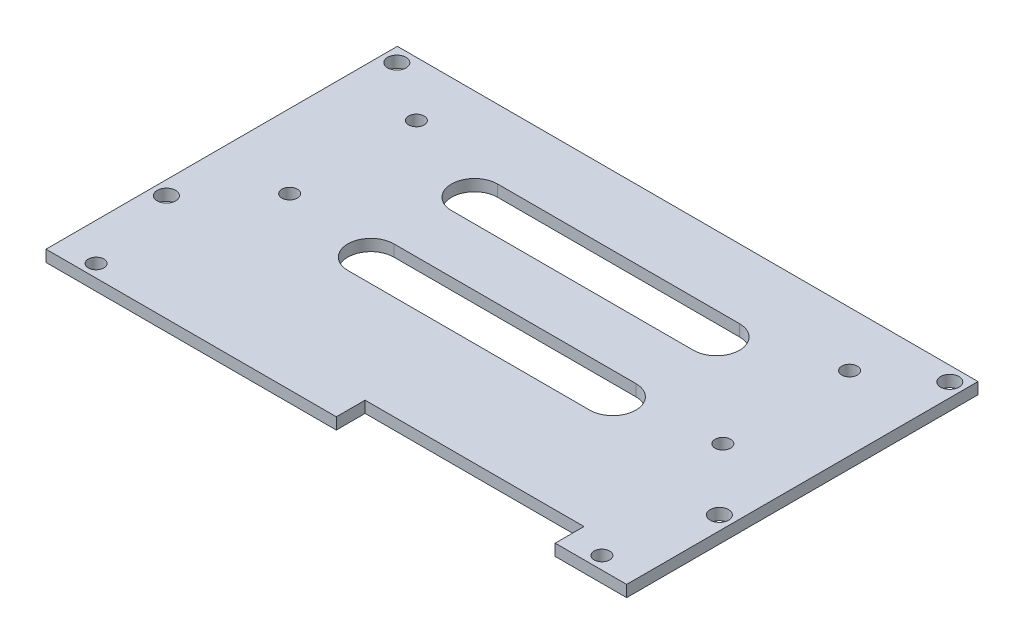
ISO-10303-21;
HEADER;
FILE_DESCRIPTION(('STEP AP214'),'2;1');
FILE_NAME('part.step','',(''),(''),'','','');
FILE_SCHEMA(('AUTOMOTIVE_DESIGN { 1 0 10303 214 1 1 1 1 }'));
ENDSEC;
DATA;
#1=APPLICATION_CONTEXT('core data for automotive mechanical design processes');
#2=APPLICATION_PROTOCOL_DEFINITION('international standard','automotive_design',2000,#1);
#3=PRODUCT_CONTEXT('',#1,'mechanical');
#4=PRODUCT('Part','Part','',(#3));
#5=PRODUCT_RELATED_PRODUCT_CATEGORY('part','',(#4));
#6=PRODUCT_DEFINITION_FORMATION('','',#4);
#7=PRODUCT_DEFINITION_CONTEXT('part definition',#1,'design');
#8=PRODUCT_DEFINITION('design','',#6,#7);
#9=PRODUCT_DEFINITION_SHAPE('','',#8);
#10=(LENGTH_UNIT() NAMED_UNIT(*) SI_UNIT(.MILLI.,.METRE.));
#11=(NAMED_UNIT(*) PLANE_ANGLE_UNIT() SI_UNIT($,.RADIAN.));
#12=(NAMED_UNIT(*) SI_UNIT($,.STERADIAN.) SOLID_ANGLE_UNIT());
#13=UNCERTAINTY_MEASURE_WITH_UNIT(LENGTH_MEASURE(1.E-05),#10,'distance_accuracy_value','');
#14=(GEOMETRIC_REPRESENTATION_CONTEXT(3) GLOBAL_UNCERTAINTY_ASSIGNED_CONTEXT((#13)) GLOBAL_UNIT_ASSIGNED_CONTEXT((#10,
#11,#12)) REPRESENTATION_CONTEXT('',''));
#15=CARTESIAN_POINT('',(0.,0.,0.));
#16=DIRECTION('',(0.,0.,1.));
#17=DIRECTION('',(1.,0.,0.));
#18=AXIS2_PLACEMENT_3D('',#15,#16,#17);
#19=CARTESIAN_POINT('',(-40.4,2.,27.));
#20=DIRECTION('',(0.,0.,-1.));
#21=DIRECTION('',(-1.,0.,0.));
#22=AXIS2_PLACEMENT_3D('',#19,#20,#21);
#23=PLANE('',#22);
#24=DIRECTION('',(1.,0.,0.));
#25=VECTOR('',#24,1.);
#26=CARTESIAN_POINT('',(-40.4,0.,27.));
#27=LINE('',#26,#25);
#28=CARTESIAN_POINT('',(-50.4,0.,27.));
#29=VERTEX_POINT('',#28);
#30=CARTESIAN_POINT('',(0.,0.,27.));
#31=VERTEX_POINT('',#30);
#32=EDGE_CURVE('E379',#29,#31,#27,.T.);
#33=ORIENTED_EDGE('',*,*,#32,.T.);
#34=DIRECTION('',(0.,-1.,0.));
#35=VECTOR('',#34,1.);
#36=CARTESIAN_POINT('',(0.,2.001,27.));
#37=LINE('',#36,#35);
#38=CARTESIAN_POINT('',(0.,2.,27.));
#39=VERTEX_POINT('',#38);
#40=EDGE_CURVE('E169',#39,#31,#37,.T.);
#41=ORIENTED_EDGE('',*,*,#40,.F.);
#42=DIRECTION('',(1.,0.,0.));
#43=VECTOR('',#42,1.);
#44=CARTESIAN_POINT('',(50.4,2.,27.));
#45=LINE('',#44,#43);
#46=CARTESIAN_POINT('',(-50.4,2.,27.));
#47=VERTEX_POINT('',#46);
#48=EDGE_CURVE('E353',#47,#39,#45,.T.);
#49=ORIENTED_EDGE('',*,*,#48,.F.);
#50=DIRECTION('',(0.,-1.,0.));
#51=VECTOR('',#50,1.);
#52=CARTESIAN_POINT('',(-50.4,2.,27.));
#53=LINE('',#52,#51);
#54=EDGE_CURVE('E367',#47,#29,#53,.T.);
#55=ORIENTED_EDGE('',*,*,#54,.T.);
#56=EDGE_LOOP('',(#33,#41,#49,#55));
#57=FACE_BOUND('',#56,.T.);
#58=ADVANCED_FACE('F39',(#57),#23,.F.);
#59=CARTESIAN_POINT('',(0.,2.,0.));
#60=DIRECTION('',(0.,1.,0.));
#61=DIRECTION('',(0.,0.,1.));
#62=AXIS2_PLACEMENT_3D('',#59,#60,#61);
#63=PLANE('',#62);
#64=DIRECTION('',(0.,0.,-1.));
#65=VECTOR('',#64,1.);
#66=CARTESIAN_POINT('',(0.,2.,34.0093244278953));
#67=LINE('',#66,#65);
#68=CARTESIAN_POINT('',(0.,2.,22.));
#69=VERTEX_POINT('',#68);
#70=EDGE_CURVE('E173',#39,#69,#67,.T.);
#71=ORIENTED_EDGE('',*,*,#70,.T.);
#72=DIRECTION('',(1.,0.,0.));
#73=VECTOR('',#72,1.);
#74=CARTESIAN_POINT('',(0.,2.,22.));
#75=LINE('',#74,#73);
#76=CARTESIAN_POINT('',(38.,2.,22.));
#77=VERTEX_POINT('',#76);
#78=EDGE_CURVE('E159',#69,#77,#75,.T.);
#79=ORIENTED_EDGE('',*,*,#78,.T.);
#80=DIRECTION('',(0.,0.,1.));
#81=VECTOR('',#80,1.);
#82=CARTESIAN_POINT('',(38.,2.,34.0093244278953));
#83=LINE('',#82,#81);
#84=CARTESIAN_POINT('',(38.,2.,27.));
#85=VERTEX_POINT('',#84);
#86=EDGE_CURVE('E420',#77,#85,#83,.T.);
#87=ORIENTED_EDGE('',*,*,#86,.T.);
#88=CARTESIAN_POINT('',(50.4,2.,27.));
#89=VERTEX_POINT('',#88);
#90=EDGE_CURVE('E358',#85,#89,#45,.T.);
#91=ORIENTED_EDGE('',*,*,#90,.T.);
#92=DIRECTION('',(0.,0.,-1.));
#93=VECTOR('',#92,1.);
#94=CARTESIAN_POINT('',(50.4,2.,-27.));
#95=LINE('',#94,#93);
#96=CARTESIAN_POINT('',(50.4,2.,-34.));
#97=VERTEX_POINT('',#96);
#98=EDGE_CURVE('E357',#89,#97,#95,.T.);
#99=ORIENTED_EDGE('',*,*,#98,.T.);
#100=DIRECTION('',(-1.,0.,0.));
#101=VECTOR('',#100,1.);
#102=CARTESIAN_POINT('',(-50.4,2.,-34.));
#103=LINE('',#102,#101);
#104=CARTESIAN_POINT('',(-50.4,2.,-34.));
#105=VERTEX_POINT('',#104);
#106=EDGE_CURVE('E361',#97,#105,#103,.T.);
#107=ORIENTED_EDGE('',*,*,#106,.T.);
#108=DIRECTION('',(0.,0.,1.));
#109=VECTOR('',#108,1.);
#110=CARTESIAN_POINT('',(-50.4,2.,-27.));
#111=LINE('',#110,#109);
#112=EDGE_CURVE('E364',#105,#47,#111,.T.);
#113=ORIENTED_EDGE('',*,*,#112,.T.);
#114=ORIENTED_EDGE('',*,*,#48,.T.);
#115=EDGE_LOOP('',(#71,#79,#87,#91,#99,#107,#113,#114));
#116=FACE_BOUND('',#115,.T.);
#117=CARTESIAN_POINT('',(-37.6,2.,-2.5));
#118=DIRECTION('',(0.,1.,0.));
#119=DIRECTION('',(0.,0.,1.));
#120=AXIS2_PLACEMENT_3D('',#117,#118,#119);
#121=CIRCLE('',#120,1.35);
#122=CARTESIAN_POINT('',(-37.6,2.,-1.15));
#123=VERTEX_POINT('',#122);
#124=EDGE_CURVE('E197',#123,#123,#121,.T.);
#125=ORIENTED_EDGE('',*,*,#124,.F.);
#126=EDGE_LOOP('',(#125));
#127=FACE_BOUND('',#126,.T.);
#128=CARTESIAN_POINT('',(48.,2.,8.49999999999999));
#129=DIRECTION('',(0.,1.,0.));
#130=DIRECTION('',(0.,0.,-1.));
#131=AXIS2_PLACEMENT_3D('',#128,#129,#130);
#132=CIRCLE('',#131,1.6);
#133=CARTESIAN_POINT('',(48.,2.,6.89999999999999));
#134=VERTEX_POINT('',#133);
#135=EDGE_CURVE('E213',#134,#134,#132,.T.);
#136=ORIENTED_EDGE('',*,*,#135,.F.);
#137=EDGE_LOOP('',(#136));
#138=FACE_BOUND('',#137,.T.);
#139=CARTESIAN_POINT('',(37.6,2.,-24.5));
#140=DIRECTION('',(0.,1.,0.));
#141=DIRECTION('',(0.,0.,-1.));
#142=AXIS2_PLACEMENT_3D('',#139,#140,#141);
#143=CIRCLE('',#142,1.35);
#144=CARTESIAN_POINT('',(37.6,2.,-25.85));
#145=VERTEX_POINT('',#144);
#146=EDGE_CURVE('E229',#145,#145,#143,.T.);
#147=ORIENTED_EDGE('',*,*,#146,.F.);
#148=EDGE_LOOP('',(#147));
#149=FACE_BOUND('',#148,.T.);
#150=DIRECTION('',(-1.,0.,0.));
#151=VECTOR('',#150,1.);
#152=CARTESIAN_POINT('',(-21.,2.,-4.));
#153=LINE('',#152,#151);
#154=CARTESIAN_POINT('',(21.,2.,-4.));
#155=VERTEX_POINT('',#154);
#156=CARTESIAN_POINT('',(-21.,2.,-4.));
#157=VERTEX_POINT('',#156);
#158=EDGE_CURVE('E289',#155,#157,#153,.T.);
#159=ORIENTED_EDGE('',*,*,#158,.F.);
#160=CARTESIAN_POINT('',(21.,2.,0.));
#161=DIRECTION('',(0.,1.,0.));
#162=DIRECTION('',(0.,0.,-1.));
#163=AXIS2_PLACEMENT_3D('',#160,#161,#162);
#164=CIRCLE('',#163,4.);
#165=CARTESIAN_POINT('',(21.,2.,4.));
#166=VERTEX_POINT('',#165);
#167=EDGE_CURVE('E286',#166,#155,#164,.T.);
#168=ORIENTED_EDGE('',*,*,#167,.F.);
#169=DIRECTION('',(1.,0.,0.));
#170=VECTOR('',#169,1.);
#171=CARTESIAN_POINT('',(-21.,2.,4.));
#172=LINE('',#171,#170);
#173=CARTESIAN_POINT('',(-21.,2.,4.));
#174=VERTEX_POINT('',#173);
#175=EDGE_CURVE('E297',#174,#166,#172,.T.);
#176=ORIENTED_EDGE('',*,*,#175,.F.);
#177=CARTESIAN_POINT('',(-21.,2.,0.));
#178=DIRECTION('',(0.,1.,0.));
#179=DIRECTION('',(0.,0.,1.));
#180=AXIS2_PLACEMENT_3D('',#177,#178,#179);
#181=CIRCLE('',#180,4.);
#182=EDGE_CURVE('E293',#157,#174,#181,.T.);
#183=ORIENTED_EDGE('',*,*,#182,.F.);
#184=EDGE_LOOP('',(#159,#168,#176,#183));
#185=FACE_BOUND('',#184,.T.);
#186=CARTESIAN_POINT('',(-37.6,2.,-24.5));
#187=DIRECTION('',(0.,1.,0.));
#188=DIRECTION('',(0.,0.,1.));
#189=AXIS2_PLACEMENT_3D('',#186,#187,#188);
#190=CIRCLE('',#189,1.35);
#191=CARTESIAN_POINT('',(-37.6,2.,-23.15));
#192=VERTEX_POINT('',#191);
#193=EDGE_CURVE('E329',#192,#192,#190,.T.);
#194=ORIENTED_EDGE('',*,*,#193,.F.);
#195=EDGE_LOOP('',(#194));
#196=FACE_BOUND('',#195,.T.);
#197=CARTESIAN_POINT('',(-48.,2.,-31.5));
#198=DIRECTION('',(0.,1.,0.));
#199=DIRECTION('',(0.,0.,1.));
#200=AXIS2_PLACEMENT_3D('',#197,#198,#199);
#201=CIRCLE('',#200,1.6);
#202=CARTESIAN_POINT('',(-48.,2.,-29.9));
#203=VERTEX_POINT('',#202);
#204=EDGE_CURVE('E345',#203,#203,#201,.T.);
#205=ORIENTED_EDGE('',*,*,#204,.F.);
#206=EDGE_LOOP('',(#205));
#207=FACE_BOUND('',#206,.T.);
#208=CARTESIAN_POINT('',(-48.,2.,8.5));
#209=DIRECTION('',(0.,1.,0.));
#210=DIRECTION('',(0.,0.,1.));
#211=AXIS2_PLACEMENT_3D('',#208,#209,#210);
#212=CIRCLE('',#211,1.6);
#213=CARTESIAN_POINT('',(-48.,2.,10.1));
#214=VERTEX_POINT('',#213);
#215=EDGE_CURVE('E337',#214,#214,#212,.T.);
#216=ORIENTED_EDGE('',*,*,#215,.F.);
#217=EDGE_LOOP('',(#216));
#218=FACE_BOUND('',#217,.T.);
#219=CARTESIAN_POINT('',(-43.8999999999998,2.,24.8));
#220=DIRECTION('',(0.,1.,0.));
#221=DIRECTION('',(0.,0.,1.));
#222=AXIS2_PLACEMENT_3D('',#219,#220,#221);
#223=CIRCLE('',#222,1.35);
#224=CARTESIAN_POINT('',(-43.8999999999998,2.,26.15));
#225=VERTEX_POINT('',#224);
#226=EDGE_CURVE('E278',#225,#225,#223,.T.);
#227=ORIENTED_EDGE('',*,*,#226,.F.);
#228=EDGE_LOOP('',(#227));
#229=FACE_BOUND('',#228,.T.);
#230=DIRECTION('',(-1.,0.,0.));
#231=VECTOR('',#230,1.);
#232=CARTESIAN_POINT('',(-21.0000000000001,2.,-22.));
#233=LINE('',#232,#231);
#234=CARTESIAN_POINT('',(20.9999999999999,2.,-22.));
#235=VERTEX_POINT('',#234);
#236=CARTESIAN_POINT('',(-21.0000000000001,2.,-22.));
#237=VERTEX_POINT('',#236);
#238=EDGE_CURVE('E240',#235,#237,#233,.T.);
#239=ORIENTED_EDGE('',*,*,#238,.F.);
#240=CARTESIAN_POINT('',(20.9999999999999,2.,-18.));
#241=DIRECTION('',(0.,1.,0.));
#242=DIRECTION('',(0.,0.,-1.));
#243=AXIS2_PLACEMENT_3D('',#240,#241,#242);
#244=CIRCLE('',#243,4.);
#245=CARTESIAN_POINT('',(20.9999999999999,2.,-14.));
#246=VERTEX_POINT('',#245);
#247=EDGE_CURVE('E237',#246,#235,#244,.T.);
#248=ORIENTED_EDGE('',*,*,#247,.F.);
#249=DIRECTION('',(1.,0.,0.));
#250=VECTOR('',#249,1.);
#251=CARTESIAN_POINT('',(-21.0000000000001,2.,-14.));
#252=LINE('',#251,#250);
#253=CARTESIAN_POINT('',(-21.0000000000001,2.,-14.));
#254=VERTEX_POINT('',#253);
#255=EDGE_CURVE('E247',#254,#246,#252,.T.);
#256=ORIENTED_EDGE('',*,*,#255,.F.);
#257=CARTESIAN_POINT('',(-21.0000000000001,2.,-18.));
#258=DIRECTION('',(0.,1.,0.));
#259=DIRECTION('',(0.,0.,1.));
#260=AXIS2_PLACEMENT_3D('',#257,#258,#259);
#261=CIRCLE('',#260,4.);
#262=EDGE_CURVE('E244',#237,#254,#261,.T.);
#263=ORIENTED_EDGE('',*,*,#262,.F.);
#264=EDGE_LOOP('',(#239,#248,#256,#263));
#265=FACE_BOUND('',#264,.T.);
#266=CARTESIAN_POINT('',(43.8999999999998,2.,24.8));
#267=DIRECTION('',(0.,1.,0.));
#268=DIRECTION('',(0.,0.,-1.));
#269=AXIS2_PLACEMENT_3D('',#266,#267,#268);
#270=CIRCLE('',#269,1.35);
#271=CARTESIAN_POINT('',(43.8999999999998,2.,23.45));
#272=VERTEX_POINT('',#271);
#273=EDGE_CURVE('E221',#272,#272,#270,.T.);
#274=ORIENTED_EDGE('',*,*,#273,.F.);
#275=EDGE_LOOP('',(#274));
#276=FACE_BOUND('',#275,.T.);
#277=CARTESIAN_POINT('',(48.,2.,-31.5));
#278=DIRECTION('',(0.,1.,0.));
#279=DIRECTION('',(0.,0.,-1.));
#280=AXIS2_PLACEMENT_3D('',#277,#278,#279);
#281=CIRCLE('',#280,1.6);
#282=CARTESIAN_POINT('',(48.,2.,-33.1));
#283=VERTEX_POINT('',#282);
#284=EDGE_CURVE('E205',#283,#283,#281,.T.);
#285=ORIENTED_EDGE('',*,*,#284,.F.);
#286=EDGE_LOOP('',(#285));
#287=FACE_BOUND('',#286,.T.);
#288=CARTESIAN_POINT('',(37.6,2.,-2.5));
#289=DIRECTION('',(0.,1.,0.));
#290=DIRECTION('',(0.,0.,-1.));
#291=AXIS2_PLACEMENT_3D('',#288,#289,#290);
#292=CIRCLE('',#291,1.35);
#293=CARTESIAN_POINT('',(37.6,2.,-3.85));
#294=VERTEX_POINT('',#293);
#295=EDGE_CURVE('E189',#294,#294,#292,.T.);
#296=ORIENTED_EDGE('',*,*,#295,.F.);
#297=EDGE_LOOP('',(#296));
#298=FACE_BOUND('',#297,.T.);
#299=ADVANCED_FACE('F406',(#116,#127,#138,#149,#185,#196,#207,#218,#229,#265,#276,#287,#298),
#63,.T.);
#300=CARTESIAN_POINT('',(0.,0.,0.));
#301=DIRECTION('',(0.,1.,0.));
#302=DIRECTION('',(0.,0.,1.));
#303=AXIS2_PLACEMENT_3D('',#300,#301,#302);
#304=PLANE('',#303);
#305=CARTESIAN_POINT('',(-43.8999999999998,0.,24.8));
#306=DIRECTION('',(0.,1.,0.));
#307=DIRECTION('',(0.,0.,1.));
#308=AXIS2_PLACEMENT_3D('',#305,#306,#307);
#309=CIRCLE('',#308,1.35);
#310=CARTESIAN_POINT('',(-43.8999999999998,0.,26.15));
#311=VERTEX_POINT('',#310);
#312=EDGE_CURVE('E277',#311,#311,#309,.T.);
#313=ORIENTED_EDGE('',*,*,#312,.T.);
#314=EDGE_LOOP('',(#313));
#315=FACE_BOUND('',#314,.T.);
#316=CARTESIAN_POINT('',(21.,0.,0.));
#317=DIRECTION('',(0.,1.,0.));
#318=DIRECTION('',(0.,0.,-1.));
#319=AXIS2_PLACEMENT_3D('',#316,#317,#318);
#320=CIRCLE('',#319,4.);
#321=CARTESIAN_POINT('',(21.,0.,4.));
#322=VERTEX_POINT('',#321);
#323=CARTESIAN_POINT('',(21.,0.,-4.));
#324=VERTEX_POINT('',#323);
#325=EDGE_CURVE('E282',#322,#324,#320,.T.);
#326=ORIENTED_EDGE('',*,*,#325,.T.);
#327=DIRECTION('',(-1.,0.,0.));
#328=VECTOR('',#327,1.);
#329=CARTESIAN_POINT('',(-21.,0.,-4.));
#330=LINE('',#329,#328);
#331=CARTESIAN_POINT('',(-21.,0.,-4.));
#332=VERTEX_POINT('',#331);
#333=EDGE_CURVE('E304',#324,#332,#330,.T.);
#334=ORIENTED_EDGE('',*,*,#333,.T.);
#335=CARTESIAN_POINT('',(-21.,0.,0.));
#336=DIRECTION('',(0.,1.,0.));
#337=DIRECTION('',(0.,0.,1.));
#338=AXIS2_PLACEMENT_3D('',#335,#336,#337);
#339=CIRCLE('',#338,4.);
#340=CARTESIAN_POINT('',(-21.,0.,4.));
#341=VERTEX_POINT('',#340);
#342=EDGE_CURVE('E308',#332,#341,#339,.T.);
#343=ORIENTED_EDGE('',*,*,#342,.T.);
#344=DIRECTION('',(1.,0.,0.));
#345=VECTOR('',#344,1.);
#346=CARTESIAN_POINT('',(-21.,0.,4.));
#347=LINE('',#346,#345);
#348=EDGE_CURVE('E290',#341,#322,#347,.T.);
#349=ORIENTED_EDGE('',*,*,#348,.T.);
#350=EDGE_LOOP('',(#326,#334,#343,#349));
#351=FACE_BOUND('',#350,.T.);
#352=DIRECTION('',(1.,0.,0.));
#353=VECTOR('',#352,1.);
#354=CARTESIAN_POINT('',(0.,0.,22.));
#355=LINE('',#354,#353);
#356=CARTESIAN_POINT('',(0.,0.,22.));
#357=VERTEX_POINT('',#356);
#358=CARTESIAN_POINT('',(38.,0.,22.));
#359=VERTEX_POINT('',#358);
#360=EDGE_CURVE('E157',#357,#359,#355,.T.);
#361=ORIENTED_EDGE('',*,*,#360,.F.);
#362=DIRECTION('',(0.,0.,-1.));
#363=VECTOR('',#362,1.);
#364=CARTESIAN_POINT('',(0.,0.,34.0093244278953));
#365=LINE('',#364,#363);
#366=EDGE_CURVE('E166',#31,#357,#365,.T.);
#367=ORIENTED_EDGE('',*,*,#366,.F.);
#368=ORIENTED_EDGE('',*,*,#32,.F.);
#369=DIRECTION('',(0.,0.,1.));
#370=VECTOR('',#369,1.);
#371=CARTESIAN_POINT('',(-50.4,0.,-27.));
#372=LINE('',#371,#370);
#373=CARTESIAN_POINT('',(-50.4,0.,-34.));
#374=VERTEX_POINT('',#373);
#375=EDGE_CURVE('E374',#374,#29,#372,.T.);
#376=ORIENTED_EDGE('',*,*,#375,.F.);
#377=DIRECTION('',(-1.,0.,0.));
#378=VECTOR('',#377,1.);
#379=CARTESIAN_POINT('',(-50.4,0.,-34.));
#380=LINE('',#379,#378);
#381=CARTESIAN_POINT('',(50.4,0.,-34.));
#382=VERTEX_POINT('',#381);
#383=EDGE_CURVE('E370',#382,#374,#380,.T.);
#384=ORIENTED_EDGE('',*,*,#383,.F.);
#385=DIRECTION('',(0.,0.,-1.));
#386=VECTOR('',#385,1.);
#387=CARTESIAN_POINT('',(50.4,0.,-34.));
#388=LINE('',#387,#386);
#389=CARTESIAN_POINT('',(50.4,0.,27.));
#390=VERTEX_POINT('',#389);
#391=EDGE_CURVE('E349',#390,#382,#388,.T.);
#392=ORIENTED_EDGE('',*,*,#391,.F.);
#393=CARTESIAN_POINT('',(38.,0.,27.));
#394=VERTEX_POINT('',#393);
#395=EDGE_CURVE('E378',#394,#390,#27,.T.);
#396=ORIENTED_EDGE('',*,*,#395,.F.);
#397=DIRECTION('',(0.,0.,1.));
#398=VECTOR('',#397,1.);
#399=CARTESIAN_POINT('',(38.,0.,34.0093244278953));
#400=LINE('',#399,#398);
#401=EDGE_CURVE('E55',#359,#394,#400,.T.);
#402=ORIENTED_EDGE('',*,*,#401,.F.);
#403=EDGE_LOOP('',(#361,#367,#368,#376,#384,#392,#396,#402));
#404=FACE_BOUND('',#403,.T.);
#405=CARTESIAN_POINT('',(-48.,0.,-31.5));
#406=DIRECTION('',(0.,1.,0.));
#407=DIRECTION('',(0.,0.,1.));
#408=AXIS2_PLACEMENT_3D('',#405,#406,#407);
#409=CIRCLE('',#408,1.6);
#410=CARTESIAN_POINT('',(-48.,0.,-29.9));
#411=VERTEX_POINT('',#410);
#412=EDGE_CURVE('E341',#411,#411,#409,.T.);
#413=ORIENTED_EDGE('',*,*,#412,.T.);
#414=EDGE_LOOP('',(#413));
#415=FACE_BOUND('',#414,.T.);
#416=CARTESIAN_POINT('',(-48.,0.,8.5));
#417=DIRECTION('',(0.,1.,0.));
#418=DIRECTION('',(0.,0.,1.));
#419=AXIS2_PLACEMENT_3D('',#416,#417,#418);
#420=CIRCLE('',#419,1.6);
#421=CARTESIAN_POINT('',(-48.,0.,10.1));
#422=VERTEX_POINT('',#421);
#423=EDGE_CURVE('E333',#422,#422,#420,.T.);
#424=ORIENTED_EDGE('',*,*,#423,.T.);
#425=EDGE_LOOP('',(#424));
#426=FACE_BOUND('',#425,.T.);
#427=CARTESIAN_POINT('',(-37.6,0.,-24.5));
#428=DIRECTION('',(0.,1.,0.));
#429=DIRECTION('',(0.,0.,1.));
#430=AXIS2_PLACEMENT_3D('',#427,#428,#429);
#431=CIRCLE('',#430,1.35);
#432=CARTESIAN_POINT('',(-37.6,0.,-23.15));
#433=VERTEX_POINT('',#432);
#434=EDGE_CURVE('E328',#433,#433,#431,.T.);
#435=ORIENTED_EDGE('',*,*,#434,.T.);
#436=EDGE_LOOP('',(#435));
#437=FACE_BOUND('',#436,.T.);
#438=CARTESIAN_POINT('',(20.9999999999999,0.,-18.));
#439=DIRECTION('',(0.,1.,0.));
#440=DIRECTION('',(0.,0.,-1.));
#441=AXIS2_PLACEMENT_3D('',#438,#439,#440);
#442=CIRCLE('',#441,4.);
#443=CARTESIAN_POINT('',(20.9999999999999,0.,-14.));
#444=VERTEX_POINT('',#443);
#445=CARTESIAN_POINT('',(20.9999999999999,0.,-22.));
#446=VERTEX_POINT('',#445);
#447=EDGE_CURVE('E233',#444,#446,#442,.T.);
#448=ORIENTED_EDGE('',*,*,#447,.T.);
#449=DIRECTION('',(-1.,0.,0.));
#450=VECTOR('',#449,1.);
#451=CARTESIAN_POINT('',(-21.0000000000001,0.,-22.));
#452=LINE('',#451,#450);
#453=CARTESIAN_POINT('',(-21.0000000000001,0.,-22.));
#454=VERTEX_POINT('',#453);
#455=EDGE_CURVE('E254',#446,#454,#452,.T.);
#456=ORIENTED_EDGE('',*,*,#455,.T.);
#457=CARTESIAN_POINT('',(-21.0000000000001,0.,-18.));
#458=DIRECTION('',(0.,1.,0.));
#459=DIRECTION('',(0.,0.,1.));
#460=AXIS2_PLACEMENT_3D('',#457,#458,#459);
#461=CIRCLE('',#460,4.);
#462=CARTESIAN_POINT('',(-21.0000000000001,0.,-14.));
#463=VERTEX_POINT('',#462);
#464=EDGE_CURVE('E258',#454,#463,#461,.T.);
#465=ORIENTED_EDGE('',*,*,#464,.T.);
#466=DIRECTION('',(1.,0.,0.));
#467=VECTOR('',#466,1.);
#468=CARTESIAN_POINT('',(-21.0000000000001,0.,-14.));
#469=LINE('',#468,#467);
#470=EDGE_CURVE('E241',#463,#444,#469,.T.);
#471=ORIENTED_EDGE('',*,*,#470,.T.);
#472=EDGE_LOOP('',(#448,#456,#465,#471));
#473=FACE_BOUND('',#472,.T.);
#474=CARTESIAN_POINT('',(37.6,0.,-24.5));
#475=DIRECTION('',(0.,1.,0.));
#476=DIRECTION('',(0.,0.,-1.));
#477=AXIS2_PLACEMENT_3D('',#474,#475,#476);
#478=CIRCLE('',#477,1.35);
#479=CARTESIAN_POINT('',(37.6,0.,-25.85));
#480=VERTEX_POINT('',#479);
#481=EDGE_CURVE('E225',#480,#480,#478,.T.);
#482=ORIENTED_EDGE('',*,*,#481,.T.);
#483=EDGE_LOOP('',(#482));
#484=FACE_BOUND('',#483,.T.);
#485=CARTESIAN_POINT('',(43.8999999999998,0.,24.8));
#486=DIRECTION('',(0.,1.,0.));
#487=DIRECTION('',(0.,0.,-1.));
#488=AXIS2_PLACEMENT_3D('',#485,#486,#487);
#489=CIRCLE('',#488,1.35);
#490=CARTESIAN_POINT('',(43.8999999999998,0.,23.45));
#491=VERTEX_POINT('',#490);
#492=EDGE_CURVE('E217',#491,#491,#489,.T.);
#493=ORIENTED_EDGE('',*,*,#492,.T.);
#494=EDGE_LOOP('',(#493));
#495=FACE_BOUND('',#494,.T.);
#496=CARTESIAN_POINT('',(48.,0.,8.49999999999999));
#497=DIRECTION('',(0.,1.,0.));
#498=DIRECTION('',(0.,0.,-1.));
#499=AXIS2_PLACEMENT_3D('',#496,#497,#498);
#500=CIRCLE('',#499,1.6);
#501=CARTESIAN_POINT('',(48.,0.,6.89999999999999));
#502=VERTEX_POINT('',#501);
#503=EDGE_CURVE('E209',#502,#502,#500,.T.);
#504=ORIENTED_EDGE('',*,*,#503,.T.);
#505=EDGE_LOOP('',(#504));
#506=FACE_BOUND('',#505,.T.);
#507=CARTESIAN_POINT('',(48.,0.,-31.5));
#508=DIRECTION('',(0.,1.,0.));
#509=DIRECTION('',(0.,0.,-1.));
#510=AXIS2_PLACEMENT_3D('',#507,#508,#509);
#511=CIRCLE('',#510,1.6);
#512=CARTESIAN_POINT('',(48.,0.,-33.1));
#513=VERTEX_POINT('',#512);
#514=EDGE_CURVE('E201',#513,#513,#511,.T.);
#515=ORIENTED_EDGE('',*,*,#514,.T.);
#516=EDGE_LOOP('',(#515));
#517=FACE_BOUND('',#516,.T.);
#518=CARTESIAN_POINT('',(-37.6,0.,-2.5));
#519=DIRECTION('',(0.,1.,0.));
#520=DIRECTION('',(0.,0.,1.));
#521=AXIS2_PLACEMENT_3D('',#518,#519,#520);
#522=CIRCLE('',#521,1.35);
#523=CARTESIAN_POINT('',(-37.6,0.,-1.15));
#524=VERTEX_POINT('',#523);
#525=EDGE_CURVE('E193',#524,#524,#522,.T.);
#526=ORIENTED_EDGE('',*,*,#525,.T.);
#527=EDGE_LOOP('',(#526));
#528=FACE_BOUND('',#527,.T.);
#529=CARTESIAN_POINT('',(37.6,0.,-2.5));
#530=DIRECTION('',(0.,1.,0.));
#531=DIRECTION('',(0.,0.,-1.));
#532=AXIS2_PLACEMENT_3D('',#529,#530,#531);
#533=CIRCLE('',#532,1.35);
#534=CARTESIAN_POINT('',(37.6,0.,-3.85));
#535=VERTEX_POINT('',#534);
#536=EDGE_CURVE('E188',#535,#535,#533,.T.);
#537=ORIENTED_EDGE('',*,*,#536,.T.);
#538=EDGE_LOOP('',(#537));
#539=FACE_BOUND('',#538,.T.);
#540=ADVANCED_FACE('F175',(#315,#351,#404,#415,#426,#437,#473,#484,#495,#506,#517,#528,#539),
#304,.F.);
#541=CARTESIAN_POINT('',(50.4,2.,-34.));
#542=DIRECTION('',(-1.,0.,0.));
#543=DIRECTION('',(0.,0.,1.));
#544=AXIS2_PLACEMENT_3D('',#541,#542,#543);
#545=PLANE('',#544);
#546=ORIENTED_EDGE('',*,*,#391,.T.);
#547=DIRECTION('',(0.,-1.,0.));
#548=VECTOR('',#547,1.);
#549=CARTESIAN_POINT('',(50.4,2.,-34.));
#550=LINE('',#549,#548);
#551=EDGE_CURVE('E48',#97,#382,#550,.T.);
#552=ORIENTED_EDGE('',*,*,#551,.F.);
#553=ORIENTED_EDGE('',*,*,#98,.F.);
#554=DIRECTION('',(0.,-1.,0.));
#555=VECTOR('',#554,1.);
#556=CARTESIAN_POINT('',(50.4,2.,27.));
#557=LINE('',#556,#555);
#558=EDGE_CURVE('E11',#89,#390,#557,.T.);
#559=ORIENTED_EDGE('',*,*,#558,.T.);
#560=EDGE_LOOP('',(#546,#552,#553,#559));
#561=FACE_BOUND('',#560,.T.);
#562=ADVANCED_FACE('F41',(#561),#545,.F.);
#563=CARTESIAN_POINT('',(-50.4,2.,-34.));
#564=DIRECTION('',(0.,0.,1.));
#565=DIRECTION('',(1.,0.,0.));
#566=AXIS2_PLACEMENT_3D('',#563,#564,#565);
#567=PLANE('',#566);
#568=ORIENTED_EDGE('',*,*,#383,.T.);
#569=DIRECTION('',(0.,-1.,0.));
#570=VECTOR('',#569,1.);
#571=CARTESIAN_POINT('',(-50.4,2.,-34.));
#572=LINE('',#571,#570);
#573=EDGE_CURVE('E385',#105,#374,#572,.T.);
#574=ORIENTED_EDGE('',*,*,#573,.F.);
#575=ORIENTED_EDGE('',*,*,#106,.F.);
#576=ORIENTED_EDGE('',*,*,#551,.T.);
#577=EDGE_LOOP('',(#568,#574,#575,#576));
#578=FACE_BOUND('',#577,.T.);
#579=ADVANCED_FACE('F394',(#578),#567,.F.);
#580=CARTESIAN_POINT('',(-50.4,2.,-27.));
#581=DIRECTION('',(1.,0.,0.));
#582=DIRECTION('',(0.,0.,-1.));
#583=AXIS2_PLACEMENT_3D('',#580,#581,#582);
#584=PLANE('',#583);
#585=ORIENTED_EDGE('',*,*,#375,.T.);
#586=ORIENTED_EDGE('',*,*,#54,.F.);
#587=ORIENTED_EDGE('',*,*,#112,.F.);
#588=ORIENTED_EDGE('',*,*,#573,.T.);
#589=EDGE_LOOP('',(#585,#586,#587,#588));
#590=FACE_BOUND('',#589,.T.);
#591=ADVANCED_FACE('F401',(#590),#584,.F.);
#592=ORIENTED_EDGE('',*,*,#90,.F.);
#593=DIRECTION('',(0.,1.,0.));
#594=VECTOR('',#593,1.);
#595=CARTESIAN_POINT('',(38.,2.001,27.));
#596=LINE('',#595,#594);
#597=EDGE_CURVE('E413',#394,#85,#596,.T.);
#598=ORIENTED_EDGE('',*,*,#597,.F.);
#599=ORIENTED_EDGE('',*,*,#395,.T.);
#600=ORIENTED_EDGE('',*,*,#558,.F.);
#601=EDGE_LOOP('',(#592,#598,#599,#600));
#602=FACE_BOUND('',#601,.T.);
#603=ADVANCED_FACE('F412',(#602),#23,.F.);
#604=CARTESIAN_POINT('',(-48.,2.,-31.5));
#605=DIRECTION('',(0.,-1.,0.));
#606=DIRECTION('',(0.,0.,-1.));
#607=AXIS2_PLACEMENT_3D('',#604,#605,#606);
#608=CYLINDRICAL_SURFACE('',#607,1.6);
#609=ORIENTED_EDGE('',*,*,#204,.T.);
#610=EDGE_LOOP('',(#609));
#611=FACE_BOUND('',#610,.T.);
#612=ORIENTED_EDGE('',*,*,#412,.F.);
#613=EDGE_LOOP('',(#612));
#614=FACE_BOUND('',#613,.T.);
#615=ADVANCED_FACE('F444',(#611,#614),#608,.F.);
#616=CARTESIAN_POINT('',(-48.,2.,8.5));
#617=DIRECTION('',(0.,-1.,0.));
#618=DIRECTION('',(0.,0.,-1.));
#619=AXIS2_PLACEMENT_3D('',#616,#617,#618);
#620=CYLINDRICAL_SURFACE('',#619,1.6);
#621=ORIENTED_EDGE('',*,*,#215,.T.);
#622=EDGE_LOOP('',(#621));
#623=FACE_BOUND('',#622,.T.);
#624=ORIENTED_EDGE('',*,*,#423,.F.);
#625=EDGE_LOOP('',(#624));
#626=FACE_BOUND('',#625,.T.);
#627=ADVANCED_FACE('F449',(#623,#626),#620,.F.);
#628=CARTESIAN_POINT('',(-37.6,2.,-24.5));
#629=DIRECTION('',(0.,-1.,0.));
#630=DIRECTION('',(0.,0.,-1.));
#631=AXIS2_PLACEMENT_3D('',#628,#629,#630);
#632=CYLINDRICAL_SURFACE('',#631,1.35);
#633=ORIENTED_EDGE('',*,*,#193,.T.);
#634=EDGE_LOOP('',(#633));
#635=FACE_BOUND('',#634,.T.);
#636=ORIENTED_EDGE('',*,*,#434,.F.);
#637=EDGE_LOOP('',(#636));
#638=FACE_BOUND('',#637,.T.);
#639=ADVANCED_FACE('F468',(#635,#638),#632,.F.);
#640=CARTESIAN_POINT('',(21.,2.,0.));
#641=DIRECTION('',(0.,-1.,0.));
#642=DIRECTION('',(0.,0.,-1.));
#643=AXIS2_PLACEMENT_3D('',#640,#641,#642);
#644=CYLINDRICAL_SURFACE('',#643,4.);
#645=ORIENTED_EDGE('',*,*,#325,.F.);
#646=DIRECTION('',(0.,-1.,0.));
#647=VECTOR('',#646,1.);
#648=CARTESIAN_POINT('',(21.,2.,4.));
#649=LINE('',#648,#647);
#650=EDGE_CURVE('E300',#166,#322,#649,.T.);
#651=ORIENTED_EDGE('',*,*,#650,.F.);
#652=ORIENTED_EDGE('',*,*,#167,.T.);
#653=DIRECTION('',(0.,-1.,0.));
#654=VECTOR('',#653,1.);
#655=CARTESIAN_POINT('',(21.,2.,-4.));
#656=LINE('',#655,#654);
#657=EDGE_CURVE('E324',#155,#324,#656,.T.);
#658=ORIENTED_EDGE('',*,*,#657,.T.);
#659=EDGE_LOOP('',(#645,#651,#652,#658));
#660=FACE_BOUND('',#659,.T.);
#661=ADVANCED_FACE('F472',(#660),#644,.F.);
#662=CARTESIAN_POINT('',(-21.,2.,-4.));
#663=DIRECTION('',(0.,0.,1.));
#664=DIRECTION('',(1.,0.,0.));
#665=AXIS2_PLACEMENT_3D('',#662,#663,#664);
#666=PLANE('',#665);
#667=ORIENTED_EDGE('',*,*,#333,.F.);
#668=ORIENTED_EDGE('',*,*,#657,.F.);
#669=ORIENTED_EDGE('',*,*,#158,.T.);
#670=DIRECTION('',(0.,-1.,0.));
#671=VECTOR('',#670,1.);
#672=CARTESIAN_POINT('',(-21.,2.,-4.));
#673=LINE('',#672,#671);
#674=EDGE_CURVE('E321',#157,#332,#673,.T.);
#675=ORIENTED_EDGE('',*,*,#674,.T.);
#676=EDGE_LOOP('',(#667,#668,#669,#675));
#677=FACE_BOUND('',#676,.T.);
#678=ADVANCED_FACE('F476',(#677),#666,.T.);
#679=CARTESIAN_POINT('',(-21.,2.,0.));
#680=DIRECTION('',(0.,-1.,0.));
#681=DIRECTION('',(0.,0.,-1.));
#682=AXIS2_PLACEMENT_3D('',#679,#680,#681);
#683=CYLINDRICAL_SURFACE('',#682,4.);
#684=ORIENTED_EDGE('',*,*,#342,.F.);
#685=ORIENTED_EDGE('',*,*,#674,.F.);
#686=ORIENTED_EDGE('',*,*,#182,.T.);
#687=DIRECTION('',(0.,-1.,0.));
#688=VECTOR('',#687,1.);
#689=CARTESIAN_POINT('',(-21.,2.,4.));
#690=LINE('',#689,#688);
#691=EDGE_CURVE('E318',#174,#341,#690,.T.);
#692=ORIENTED_EDGE('',*,*,#691,.T.);
#693=EDGE_LOOP('',(#684,#685,#686,#692));
#694=FACE_BOUND('',#693,.T.);
#695=ADVANCED_FACE('F480',(#694),#683,.F.);
#696=CARTESIAN_POINT('',(-21.,2.,4.));
#697=DIRECTION('',(0.,0.,-1.));
#698=DIRECTION('',(-1.,0.,0.));
#699=AXIS2_PLACEMENT_3D('',#696,#697,#698);
#700=PLANE('',#699);
#701=ORIENTED_EDGE('',*,*,#348,.F.);
#702=ORIENTED_EDGE('',*,*,#691,.F.);
#703=ORIENTED_EDGE('',*,*,#175,.T.);
#704=ORIENTED_EDGE('',*,*,#650,.T.);
#705=EDGE_LOOP('',(#701,#702,#703,#704));
#706=FACE_BOUND('',#705,.T.);
#707=ADVANCED_FACE('F484',(#706),#700,.T.);
#708=CARTESIAN_POINT('',(-43.8999999999998,2.,24.8));
#709=DIRECTION('',(0.,-1.,0.));
#710=DIRECTION('',(0.,0.,-1.));
#711=AXIS2_PLACEMENT_3D('',#708,#709,#710);
#712=CYLINDRICAL_SURFACE('',#711,1.35);
#713=ORIENTED_EDGE('',*,*,#226,.T.);
#714=EDGE_LOOP('',(#713));
#715=FACE_BOUND('',#714,.T.);
#716=ORIENTED_EDGE('',*,*,#312,.F.);
#717=EDGE_LOOP('',(#716));
#718=FACE_BOUND('',#717,.T.);
#719=ADVANCED_FACE('F488',(#715,#718),#712,.F.);
#720=CARTESIAN_POINT('',(20.9999999999999,2.,-18.));
#721=DIRECTION('',(0.,-1.,0.));
#722=DIRECTION('',(0.,0.,-1.));
#723=AXIS2_PLACEMENT_3D('',#720,#721,#722);
#724=CYLINDRICAL_SURFACE('',#723,4.);
#725=ORIENTED_EDGE('',*,*,#447,.F.);
#726=DIRECTION('',(0.,-1.,0.));
#727=VECTOR('',#726,1.);
#728=CARTESIAN_POINT('',(20.9999999999999,2.,-14.));
#729=LINE('',#728,#727);
#730=EDGE_CURVE('E250',#246,#444,#729,.T.);
#731=ORIENTED_EDGE('',*,*,#730,.F.);
#732=ORIENTED_EDGE('',*,*,#247,.T.);
#733=DIRECTION('',(0.,-1.,0.));
#734=VECTOR('',#733,1.);
#735=CARTESIAN_POINT('',(20.9999999999999,2.,-22.));
#736=LINE('',#735,#734);
#737=EDGE_CURVE('E273',#235,#446,#736,.T.);
#738=ORIENTED_EDGE('',*,*,#737,.T.);
#739=EDGE_LOOP('',(#725,#731,#732,#738));
#740=FACE_BOUND('',#739,.T.);
#741=ADVANCED_FACE('F492',(#740),#724,.F.);
#742=CARTESIAN_POINT('',(-21.0000000000001,2.,-22.));
#743=DIRECTION('',(0.,0.,1.));
#744=DIRECTION('',(1.,0.,0.));
#745=AXIS2_PLACEMENT_3D('',#742,#743,#744);
#746=PLANE('',#745);
#747=ORIENTED_EDGE('',*,*,#455,.F.);
#748=ORIENTED_EDGE('',*,*,#737,.F.);
#749=ORIENTED_EDGE('',*,*,#238,.T.);
#750=DIRECTION('',(0.,-1.,0.));
#751=VECTOR('',#750,1.);
#752=CARTESIAN_POINT('',(-21.0000000000001,2.,-22.));
#753=LINE('',#752,#751);
#754=EDGE_CURVE('E270',#237,#454,#753,.T.);
#755=ORIENTED_EDGE('',*,*,#754,.T.);
#756=EDGE_LOOP('',(#747,#748,#749,#755));
#757=FACE_BOUND('',#756,.T.);
#758=ADVANCED_FACE('F496',(#757),#746,.T.);
#759=CARTESIAN_POINT('',(-21.0000000000001,2.,-18.));
#760=DIRECTION('',(0.,-1.,0.));
#761=DIRECTION('',(0.,0.,-1.));
#762=AXIS2_PLACEMENT_3D('',#759,#760,#761);
#763=CYLINDRICAL_SURFACE('',#762,4.);
#764=ORIENTED_EDGE('',*,*,#464,.F.);
#765=ORIENTED_EDGE('',*,*,#754,.F.);
#766=ORIENTED_EDGE('',*,*,#262,.T.);
#767=DIRECTION('',(0.,-1.,0.));
#768=VECTOR('',#767,1.);
#769=CARTESIAN_POINT('',(-21.0000000000001,2.,-14.));
#770=LINE('',#769,#768);
#771=EDGE_CURVE('E63',#254,#463,#770,.T.);
#772=ORIENTED_EDGE('',*,*,#771,.T.);
#773=EDGE_LOOP('',(#764,#765,#766,#772));
#774=FACE_BOUND('',#773,.T.);
#775=ADVANCED_FACE('F500',(#774),#763,.F.);
#776=CARTESIAN_POINT('',(-21.0000000000001,2.,-14.));
#777=DIRECTION('',(0.,0.,-1.));
#778=DIRECTION('',(-1.,0.,0.));
#779=AXIS2_PLACEMENT_3D('',#776,#777,#778);
#780=PLANE('',#779);
#781=ORIENTED_EDGE('',*,*,#470,.F.);
#782=ORIENTED_EDGE('',*,*,#771,.F.);
#783=ORIENTED_EDGE('',*,*,#255,.T.);
#784=ORIENTED_EDGE('',*,*,#730,.T.);
#785=EDGE_LOOP('',(#781,#782,#783,#784));
#786=FACE_BOUND('',#785,.T.);
#787=ADVANCED_FACE('F504',(#786),#780,.T.);
#788=CARTESIAN_POINT('',(37.6,2.,-24.5));
#789=DIRECTION('',(0.,-1.,0.));
#790=DIRECTION('',(0.,0.,-1.));
#791=AXIS2_PLACEMENT_3D('',#788,#789,#790);
#792=CYLINDRICAL_SURFACE('',#791,1.35);
#793=ORIENTED_EDGE('',*,*,#146,.T.);
#794=EDGE_LOOP('',(#793));
#795=FACE_BOUND('',#794,.T.);
#796=ORIENTED_EDGE('',*,*,#481,.F.);
#797=EDGE_LOOP('',(#796));
#798=FACE_BOUND('',#797,.T.);
#799=ADVANCED_FACE('F508',(#795,#798),#792,.F.);
#800=CARTESIAN_POINT('',(43.8999999999998,2.,24.8));
#801=DIRECTION('',(0.,-1.,0.));
#802=DIRECTION('',(0.,0.,-1.));
#803=AXIS2_PLACEMENT_3D('',#800,#801,#802);
#804=CYLINDRICAL_SURFACE('',#803,1.35);
#805=ORIENTED_EDGE('',*,*,#273,.T.);
#806=EDGE_LOOP('',(#805));
#807=FACE_BOUND('',#806,.T.);
#808=ORIENTED_EDGE('',*,*,#492,.F.);
#809=EDGE_LOOP('',(#808));
#810=FACE_BOUND('',#809,.T.);
#811=ADVANCED_FACE('F511',(#807,#810),#804,.F.);
#812=CARTESIAN_POINT('',(48.,2.,8.49999999999999));
#813=DIRECTION('',(0.,-1.,0.));
#814=DIRECTION('',(0.,0.,-1.));
#815=AXIS2_PLACEMENT_3D('',#812,#813,#814);
#816=CYLINDRICAL_SURFACE('',#815,1.6);
#817=ORIENTED_EDGE('',*,*,#135,.T.);
#818=EDGE_LOOP('',(#817));
#819=FACE_BOUND('',#818,.T.);
#820=ORIENTED_EDGE('',*,*,#503,.F.);
#821=EDGE_LOOP('',(#820));
#822=FACE_BOUND('',#821,.T.);
#823=ADVANCED_FACE('F515',(#819,#822),#816,.F.);
#824=CARTESIAN_POINT('',(48.,2.,-31.5));
#825=DIRECTION('',(0.,-1.,0.));
#826=DIRECTION('',(0.,0.,-1.));
#827=AXIS2_PLACEMENT_3D('',#824,#825,#826);
#828=CYLINDRICAL_SURFACE('',#827,1.6);
#829=ORIENTED_EDGE('',*,*,#284,.T.);
#830=EDGE_LOOP('',(#829));
#831=FACE_BOUND('',#830,.T.);
#832=ORIENTED_EDGE('',*,*,#514,.F.);
#833=EDGE_LOOP('',(#832));
#834=FACE_BOUND('',#833,.T.);
#835=ADVANCED_FACE('F519',(#831,#834),#828,.F.);
#836=CARTESIAN_POINT('',(-37.6,2.,-2.5));
#837=DIRECTION('',(0.,-1.,0.));
#838=DIRECTION('',(0.,0.,-1.));
#839=AXIS2_PLACEMENT_3D('',#836,#837,#838);
#840=CYLINDRICAL_SURFACE('',#839,1.35);
#841=ORIENTED_EDGE('',*,*,#124,.T.);
#842=EDGE_LOOP('',(#841));
#843=FACE_BOUND('',#842,.T.);
#844=ORIENTED_EDGE('',*,*,#525,.F.);
#845=EDGE_LOOP('',(#844));
#846=FACE_BOUND('',#845,.T.);
#847=ADVANCED_FACE('F523',(#843,#846),#840,.F.);
#848=CARTESIAN_POINT('',(37.6,2.,-2.5));
#849=DIRECTION('',(0.,-1.,0.));
#850=DIRECTION('',(0.,0.,-1.));
#851=AXIS2_PLACEMENT_3D('',#848,#849,#850);
#852=CYLINDRICAL_SURFACE('',#851,1.35);
#853=ORIENTED_EDGE('',*,*,#295,.T.);
#854=EDGE_LOOP('',(#853));
#855=FACE_BOUND('',#854,.T.);
#856=ORIENTED_EDGE('',*,*,#536,.F.);
#857=EDGE_LOOP('',(#856));
#858=FACE_BOUND('',#857,.T.);
#859=ADVANCED_FACE('F433',(#855,#858),#852,.F.);
#860=CARTESIAN_POINT('',(0.,2.001,34.0093244278953));
#861=DIRECTION('',(-1.,0.,0.));
#862=DIRECTION('',(0.,0.,1.));
#863=AXIS2_PLACEMENT_3D('',#860,#861,#862);
#864=PLANE('',#863);
#865=ORIENTED_EDGE('',*,*,#40,.T.);
#866=ORIENTED_EDGE('',*,*,#366,.T.);
#867=DIRECTION('',(0.,-1.,0.));
#868=VECTOR('',#867,1.);
#869=CARTESIAN_POINT('',(0.,2.001,22.));
#870=LINE('',#869,#868);
#871=EDGE_CURVE('E153',#69,#357,#870,.T.);
#872=ORIENTED_EDGE('',*,*,#871,.F.);
#873=ORIENTED_EDGE('',*,*,#70,.F.);
#874=EDGE_LOOP('',(#865,#866,#872,#873));
#875=FACE_BOUND('',#874,.T.);
#876=ADVANCED_FACE('F167',(#875),#864,.F.);
#877=CARTESIAN_POINT('',(38.,2.001,34.0093244278953));
#878=DIRECTION('',(1.,0.,0.));
#879=DIRECTION('',(0.,0.,-1.));
#880=AXIS2_PLACEMENT_3D('',#877,#878,#879);
#881=PLANE('',#880);
#882=DIRECTION('',(0.,-1.,0.));
#883=VECTOR('',#882,1.);
#884=CARTESIAN_POINT('',(38.,2.001,22.));
#885=LINE('',#884,#883);
#886=EDGE_CURVE('E163',#77,#359,#885,.T.);
#887=ORIENTED_EDGE('',*,*,#886,.T.);
#888=ORIENTED_EDGE('',*,*,#401,.T.);
#889=ORIENTED_EDGE('',*,*,#597,.T.);
#890=ORIENTED_EDGE('',*,*,#86,.F.);
#891=EDGE_LOOP('',(#887,#888,#889,#890));
#892=FACE_BOUND('',#891,.T.);
#893=ADVANCED_FACE('F425',(#892),#881,.F.);
#894=CARTESIAN_POINT('',(0.,2.001,22.));
#895=DIRECTION('',(0.,0.,-1.));
#896=DIRECTION('',(-1.,0.,0.));
#897=AXIS2_PLACEMENT_3D('',#894,#895,#896);
#898=PLANE('',#897);
#899=ORIENTED_EDGE('',*,*,#871,.T.);
#900=ORIENTED_EDGE('',*,*,#360,.T.);
#901=ORIENTED_EDGE('',*,*,#886,.F.);
#902=ORIENTED_EDGE('',*,*,#78,.F.);
#903=EDGE_LOOP('',(#899,#900,#901,#902));
#904=FACE_BOUND('',#903,.T.);
#905=ADVANCED_FACE('F155',(#904),#898,.F.);
#906=CLOSED_SHELL('',(#58,#299,#540,#562,#579,#591,#603,#615,#627,#639,#661,#678,#695,#707,#719,
#741,#758,#775,#787,#799,#811,#823,#835,#847,#859,#876,#893,#905));
#907=MANIFOLD_SOLID_BREP('B2',#906);
#908=ADVANCED_BREP_SHAPE_REPRESENTATION('',(#18,#907),#14);
#909=SHAPE_DEFINITION_REPRESENTATION(#9,#908);
ENDSEC;
END-ISO-10303-21;
